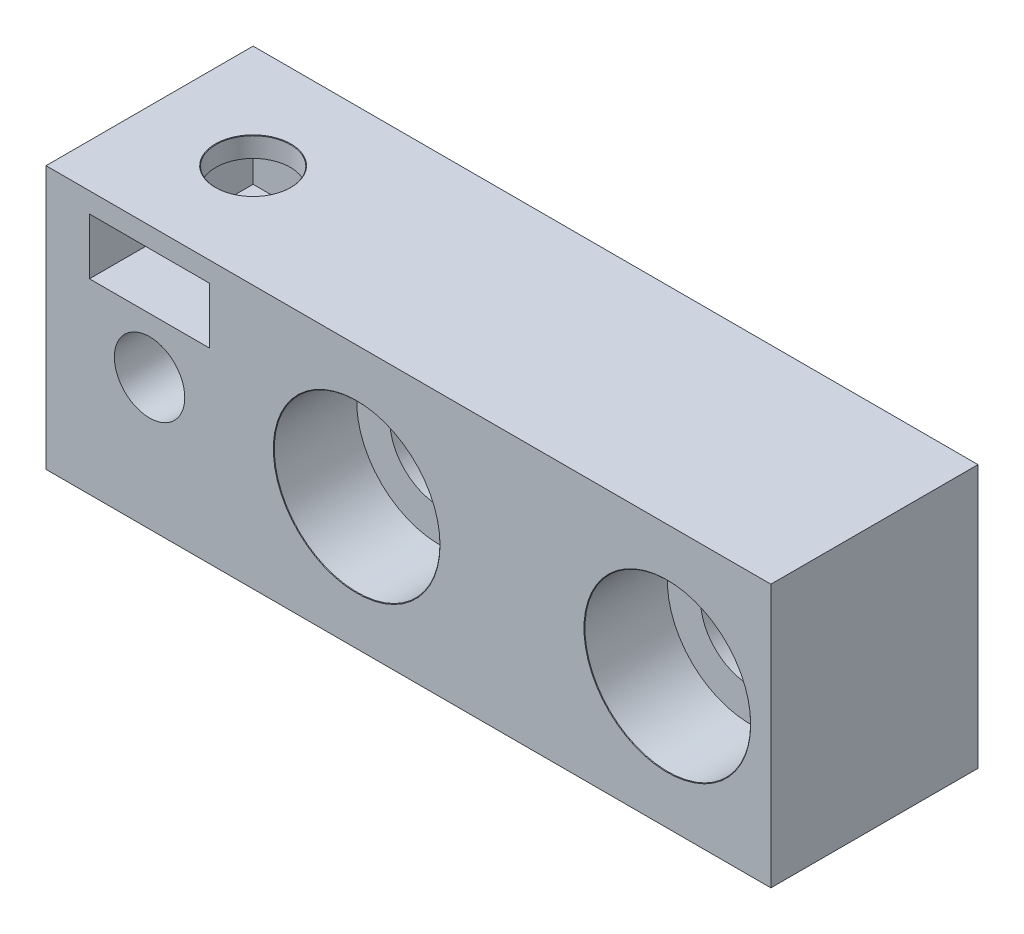
ISO-10303-21;
HEADER;
FILE_DESCRIPTION(('STEP AP214'),'2;1');
FILE_NAME('part.step','',(''),(''),'','','');
FILE_SCHEMA(('AUTOMOTIVE_DESIGN { 1 0 10303 214 1 1 1 1 }'));
ENDSEC;
DATA;
#1=APPLICATION_CONTEXT('core data for automotive mechanical design processes');
#2=APPLICATION_PROTOCOL_DEFINITION('international standard','automotive_design',2000,#1);
#3=PRODUCT_CONTEXT('',#1,'mechanical');
#4=PRODUCT('Part','Part','',(#3));
#5=PRODUCT_RELATED_PRODUCT_CATEGORY('part','',(#4));
#6=PRODUCT_DEFINITION_FORMATION('','',#4);
#7=PRODUCT_DEFINITION_CONTEXT('part definition',#1,'design');
#8=PRODUCT_DEFINITION('design','',#6,#7);
#9=PRODUCT_DEFINITION_SHAPE('','',#8);
#10=(LENGTH_UNIT() NAMED_UNIT(*) SI_UNIT(.MILLI.,.METRE.));
#11=(NAMED_UNIT(*) PLANE_ANGLE_UNIT() SI_UNIT($,.RADIAN.));
#12=(NAMED_UNIT(*) SI_UNIT($,.STERADIAN.) SOLID_ANGLE_UNIT());
#13=UNCERTAINTY_MEASURE_WITH_UNIT(LENGTH_MEASURE(1.E-05),#10,'distance_accuracy_value','');
#14=(GEOMETRIC_REPRESENTATION_CONTEXT(3) GLOBAL_UNCERTAINTY_ASSIGNED_CONTEXT((#13)) GLOBAL_UNIT_ASSIGNED_CONTEXT((#10,
#11,#12)) REPRESENTATION_CONTEXT('',''));
#15=CARTESIAN_POINT('',(0.,0.,0.));
#16=DIRECTION('',(0.,0.,1.));
#17=DIRECTION('',(1.,0.,0.));
#18=AXIS2_PLACEMENT_3D('',#15,#16,#17);
#19=CARTESIAN_POINT('',(-12.5,6.35,5.));
#20=DIRECTION('',(0.,1.,0.));
#21=DIRECTION('',(0.,0.,1.));
#22=AXIS2_PLACEMENT_3D('',#19,#20,#21);
#23=CYLINDRICAL_SURFACE('',#22,1.8);
#24=CARTESIAN_POINT('',(-12.5,5.38,5.));
#25=DIRECTION('',(0.,1.,0.));
#26=DIRECTION('',(0.,0.,1.));
#27=AXIS2_PLACEMENT_3D('',#24,#25,#26);
#28=CIRCLE('',#27,1.8);
#29=CARTESIAN_POINT('',(-12.5,5.38,6.8));
#30=VERTEX_POINT('',#29);
#31=EDGE_CURVE('E47',#30,#30,#28,.F.);
#32=ORIENTED_EDGE('',*,*,#31,.T.);
#33=EDGE_LOOP('',(#32));
#34=FACE_BOUND('',#33,.T.);
#35=CARTESIAN_POINT('',(-12.5,6.32902250922057,5.));
#36=DIRECTION('',(0.,1.,0.));
#37=DIRECTION('',(0.,0.,1.));
#38=AXIS2_PLACEMENT_3D('',#35,#36,#37);
#39=CIRCLE('',#38,1.8);
#40=CARTESIAN_POINT('',(-12.5,6.32902250922057,6.8));
#41=VERTEX_POINT('',#40);
#42=EDGE_CURVE('E179',#41,#41,#39,.T.);
#43=ORIENTED_EDGE('',*,*,#42,.T.);
#44=EDGE_LOOP('',(#43));
#45=FACE_BOUND('',#44,.T.);
#46=ADVANCED_FACE('F43',(#34,#45),#23,.F.);
#47=CARTESIAN_POINT('',(17.5,6.35,10.));
#48=DIRECTION('',(-1.,0.,0.));
#49=DIRECTION('',(0.,0.,1.));
#50=AXIS2_PLACEMENT_3D('',#47,#48,#49);
#51=PLANE('',#50);
#52=DIRECTION('',(0.,1.,0.));
#53=VECTOR('',#52,1.);
#54=CARTESIAN_POINT('',(17.5,6.35,0.));
#55=LINE('',#54,#53);
#56=CARTESIAN_POINT('',(17.5,-6.35,0.));
#57=VERTEX_POINT('',#56);
#58=CARTESIAN_POINT('',(17.5,6.35,0.));
#59=VERTEX_POINT('',#58);
#60=EDGE_CURVE('E235',#57,#59,#55,.T.);
#61=ORIENTED_EDGE('',*,*,#60,.T.);
#62=DIRECTION('',(0.,0.,-1.));
#63=VECTOR('',#62,1.);
#64=CARTESIAN_POINT('',(17.5,6.35,10.));
#65=LINE('',#64,#63);
#66=CARTESIAN_POINT('',(17.5,6.35,10.));
#67=VERTEX_POINT('',#66);
#68=EDGE_CURVE('E273',#67,#59,#65,.T.);
#69=ORIENTED_EDGE('',*,*,#68,.F.);
#70=DIRECTION('',(0.,1.,0.));
#71=VECTOR('',#70,1.);
#72=CARTESIAN_POINT('',(17.5,6.35,10.));
#73=LINE('',#72,#71);
#74=CARTESIAN_POINT('',(17.5,-6.35,10.));
#75=VERTEX_POINT('',#74);
#76=EDGE_CURVE('E236',#75,#67,#73,.T.);
#77=ORIENTED_EDGE('',*,*,#76,.F.);
#78=DIRECTION('',(0.,0.,-1.));
#79=VECTOR('',#78,1.);
#80=CARTESIAN_POINT('',(17.5,-6.35,10.));
#81=LINE('',#80,#79);
#82=EDGE_CURVE('E250',#75,#57,#81,.T.);
#83=ORIENTED_EDGE('',*,*,#82,.T.);
#84=EDGE_LOOP('',(#61,#69,#77,#83));
#85=FACE_BOUND('',#84,.T.);
#86=ADVANCED_FACE('F45',(#85),#51,.F.);
#87=CARTESIAN_POINT('',(-17.5,6.35,10.));
#88=DIRECTION('',(0.,-1.,0.));
#89=DIRECTION('',(0.,0.,-1.));
#90=AXIS2_PLACEMENT_3D('',#87,#88,#89);
#91=PLANE('',#90);
#92=CARTESIAN_POINT('',(-12.5,6.35,5.));
#93=DIRECTION('',(0.,1.,0.));
#94=DIRECTION('',(0.,0.,1.));
#95=AXIS2_PLACEMENT_3D('',#92,#93,#94);
#96=CIRCLE('',#95,1.825);
#97=CARTESIAN_POINT('',(-12.5,6.35,6.825));
#98=VERTEX_POINT('',#97);
#99=EDGE_CURVE('E175',#98,#98,#96,.T.);
#100=ORIENTED_EDGE('',*,*,#99,.F.);
#101=EDGE_LOOP('',(#100));
#102=FACE_BOUND('',#101,.T.);
#103=DIRECTION('',(-1.,0.,0.));
#104=VECTOR('',#103,1.);
#105=CARTESIAN_POINT('',(-17.5,6.35,0.));
#106=LINE('',#105,#104);
#107=CARTESIAN_POINT('',(-17.5,6.35,0.));
#108=VERTEX_POINT('',#107);
#109=EDGE_CURVE('E254',#59,#108,#106,.T.);
#110=ORIENTED_EDGE('',*,*,#109,.T.);
#111=DIRECTION('',(0.,0.,-1.));
#112=VECTOR('',#111,1.);
#113=CARTESIAN_POINT('',(-17.5,6.35,10.));
#114=LINE('',#113,#112);
#115=CARTESIAN_POINT('',(-17.5,6.35,10.));
#116=VERTEX_POINT('',#115);
#117=EDGE_CURVE('E269',#116,#108,#114,.T.);
#118=ORIENTED_EDGE('',*,*,#117,.F.);
#119=DIRECTION('',(-1.,0.,0.));
#120=VECTOR('',#119,1.);
#121=CARTESIAN_POINT('',(-17.5,6.35,10.));
#122=LINE('',#121,#120);
#123=EDGE_CURVE('E240',#67,#116,#122,.T.);
#124=ORIENTED_EDGE('',*,*,#123,.F.);
#125=ORIENTED_EDGE('',*,*,#68,.T.);
#126=EDGE_LOOP('',(#110,#118,#124,#125));
#127=FACE_BOUND('',#126,.T.);
#128=ADVANCED_FACE('F341',(#102,#127),#91,.F.);
#129=CARTESIAN_POINT('',(-17.5,6.35,10.));
#130=DIRECTION('',(1.,0.,0.));
#131=DIRECTION('',(0.,0.,-1.));
#132=AXIS2_PLACEMENT_3D('',#129,#130,#131);
#133=PLANE('',#132);
#134=DIRECTION('',(0.,-1.,0.));
#135=VECTOR('',#134,1.);
#136=CARTESIAN_POINT('',(-17.5,6.35,0.));
#137=LINE('',#136,#135);
#138=CARTESIAN_POINT('',(-17.5,-6.35,0.));
#139=VERTEX_POINT('',#138);
#140=EDGE_CURVE('E257',#108,#139,#137,.T.);
#141=ORIENTED_EDGE('',*,*,#140,.T.);
#142=DIRECTION('',(0.,0.,-1.));
#143=VECTOR('',#142,1.);
#144=CARTESIAN_POINT('',(-17.5,-6.35,10.));
#145=LINE('',#144,#143);
#146=CARTESIAN_POINT('',(-17.5,-6.35,10.));
#147=VERTEX_POINT('',#146);
#148=EDGE_CURVE('E265',#147,#139,#145,.T.);
#149=ORIENTED_EDGE('',*,*,#148,.F.);
#150=DIRECTION('',(0.,-1.,0.));
#151=VECTOR('',#150,1.);
#152=CARTESIAN_POINT('',(-17.5,6.35,10.));
#153=LINE('',#152,#151);
#154=EDGE_CURVE('E244',#116,#147,#153,.T.);
#155=ORIENTED_EDGE('',*,*,#154,.F.);
#156=ORIENTED_EDGE('',*,*,#117,.T.);
#157=EDGE_LOOP('',(#141,#149,#155,#156));
#158=FACE_BOUND('',#157,.T.);
#159=ADVANCED_FACE('F463',(#158),#133,.F.);
#160=CARTESIAN_POINT('',(-17.5,-6.35,10.));
#161=DIRECTION('',(0.,1.,0.));
#162=DIRECTION('',(0.,0.,1.));
#163=AXIS2_PLACEMENT_3D('',#160,#161,#162);
#164=PLANE('',#163);
#165=DIRECTION('',(1.,0.,0.));
#166=VECTOR('',#165,1.);
#167=CARTESIAN_POINT('',(-17.5,-6.35,0.));
#168=LINE('',#167,#166);
#169=EDGE_CURVE('E241',#139,#57,#168,.T.);
#170=ORIENTED_EDGE('',*,*,#169,.T.);
#171=ORIENTED_EDGE('',*,*,#82,.F.);
#172=DIRECTION('',(1.,0.,0.));
#173=VECTOR('',#172,1.);
#174=CARTESIAN_POINT('',(-17.5,-6.35,10.));
#175=LINE('',#174,#173);
#176=EDGE_CURVE('E247',#147,#75,#175,.T.);
#177=ORIENTED_EDGE('',*,*,#176,.F.);
#178=ORIENTED_EDGE('',*,*,#148,.T.);
#179=EDGE_LOOP('',(#170,#171,#177,#178));
#180=FACE_BOUND('',#179,.T.);
#181=ADVANCED_FACE('F382',(#180),#164,.F.);
#182=CARTESIAN_POINT('',(0.,0.,10.));
#183=DIRECTION('',(0.,0.,1.));
#184=DIRECTION('',(1.,0.,0.));
#185=AXIS2_PLACEMENT_3D('',#182,#183,#184);
#186=PLANE('',#185);
#187=DIRECTION('',(0.,-1.,0.));
#188=VECTOR('',#187,1.);
#189=CARTESIAN_POINT('',(-15.4,5.38,10.));
#190=LINE('',#189,#188);
#191=CARTESIAN_POINT('',(-15.4,5.38,10.));
#192=VERTEX_POINT('',#191);
#193=CARTESIAN_POINT('',(-15.4,2.67,10.));
#194=VERTEX_POINT('',#193);
#195=EDGE_CURVE('E61',#192,#194,#190,.T.);
#196=ORIENTED_EDGE('',*,*,#195,.F.);
#197=DIRECTION('',(-1.,0.,0.));
#198=VECTOR('',#197,1.);
#199=CARTESIAN_POINT('',(-15.4,5.38,10.));
#200=LINE('',#199,#198);
#201=CARTESIAN_POINT('',(-9.6,5.38,10.));
#202=VERTEX_POINT('',#201);
#203=EDGE_CURVE('E147',#202,#192,#200,.T.);
#204=ORIENTED_EDGE('',*,*,#203,.F.);
#205=DIRECTION('',(0.,1.,0.));
#206=VECTOR('',#205,1.);
#207=CARTESIAN_POINT('',(-9.6,5.38,10.));
#208=LINE('',#207,#206);
#209=CARTESIAN_POINT('',(-9.6,2.67,10.));
#210=VERTEX_POINT('',#209);
#211=EDGE_CURVE('E151',#210,#202,#208,.T.);
#212=ORIENTED_EDGE('',*,*,#211,.F.);
#213=DIRECTION('',(1.,0.,0.));
#214=VECTOR('',#213,1.);
#215=CARTESIAN_POINT('',(-15.4,2.67,10.));
#216=LINE('',#215,#214);
#217=EDGE_CURVE('E160',#194,#210,#216,.T.);
#218=ORIENTED_EDGE('',*,*,#217,.F.);
#219=EDGE_LOOP('',(#196,#204,#212,#218));
#220=FACE_BOUND('',#219,.T.);
#221=CARTESIAN_POINT('',(-12.5,0.,10.));
#222=DIRECTION('',(0.,0.,1.));
#223=DIRECTION('',(1.,0.,0.));
#224=AXIS2_PLACEMENT_3D('',#221,#222,#223);
#225=CIRCLE('',#224,1.7);
#226=CARTESIAN_POINT('',(-10.8,0.,10.));
#227=VERTEX_POINT('',#226);
#228=EDGE_CURVE('E187',#227,#227,#225,.T.);
#229=ORIENTED_EDGE('',*,*,#228,.F.);
#230=EDGE_LOOP('',(#229));
#231=FACE_BOUND('',#230,.T.);
#232=CARTESIAN_POINT('',(12.5,0.,10.));
#233=DIRECTION('',(0.,0.,1.));
#234=DIRECTION('',(1.,0.,0.));
#235=AXIS2_PLACEMENT_3D('',#232,#233,#234);
#236=CIRCLE('',#235,4.025);
#237=CARTESIAN_POINT('',(16.525,0.,10.));
#238=VERTEX_POINT('',#237);
#239=EDGE_CURVE('E192',#238,#238,#236,.T.);
#240=ORIENTED_EDGE('',*,*,#239,.F.);
#241=EDGE_LOOP('',(#240));
#242=FACE_BOUND('',#241,.T.);
#243=CARTESIAN_POINT('',(-2.5,0.,10.));
#244=DIRECTION('',(0.,0.,1.));
#245=DIRECTION('',(1.,0.,0.));
#246=AXIS2_PLACEMENT_3D('',#243,#244,#245);
#247=CIRCLE('',#246,4.025);
#248=CARTESIAN_POINT('',(1.525,0.,10.));
#249=VERTEX_POINT('',#248);
#250=EDGE_CURVE('E215',#249,#249,#247,.T.);
#251=ORIENTED_EDGE('',*,*,#250,.F.);
#252=EDGE_LOOP('',(#251));
#253=FACE_BOUND('',#252,.T.);
#254=ORIENTED_EDGE('',*,*,#76,.T.);
#255=ORIENTED_EDGE('',*,*,#123,.T.);
#256=ORIENTED_EDGE('',*,*,#154,.T.);
#257=ORIENTED_EDGE('',*,*,#176,.T.);
#258=EDGE_LOOP('',(#254,#255,#256,#257));
#259=FACE_BOUND('',#258,.T.);
#260=ADVANCED_FACE('F377',(#220,#231,#242,#253,#259),#186,.T.);
#261=CARTESIAN_POINT('',(0.,0.,0.));
#262=DIRECTION('',(0.,0.,1.));
#263=DIRECTION('',(1.,0.,0.));
#264=AXIS2_PLACEMENT_3D('',#261,#262,#263);
#265=PLANE('',#264);
#266=CARTESIAN_POINT('',(-12.5,0.,0.));
#267=DIRECTION('',(0.,0.,1.));
#268=DIRECTION('',(1.,0.,0.));
#269=AXIS2_PLACEMENT_3D('',#266,#267,#268);
#270=CIRCLE('',#269,1.7);
#271=CARTESIAN_POINT('',(-10.8,0.,0.));
#272=VERTEX_POINT('',#271);
#273=EDGE_CURVE('E188',#272,#272,#270,.T.);
#274=ORIENTED_EDGE('',*,*,#273,.T.);
#275=EDGE_LOOP('',(#274));
#276=FACE_BOUND('',#275,.T.);
#277=CARTESIAN_POINT('',(12.5,0.,0.));
#278=DIRECTION('',(0.,0.,1.));
#279=DIRECTION('',(1.,0.,0.));
#280=AXIS2_PLACEMENT_3D('',#277,#278,#279);
#281=CIRCLE('',#280,2.40000000000001);
#282=CARTESIAN_POINT('',(14.9,0.,0.));
#283=VERTEX_POINT('',#282);
#284=EDGE_CURVE('E211',#283,#283,#281,.T.);
#285=ORIENTED_EDGE('',*,*,#284,.T.);
#286=EDGE_LOOP('',(#285));
#287=FACE_BOUND('',#286,.T.);
#288=CARTESIAN_POINT('',(-2.5,0.,0.));
#289=DIRECTION('',(0.,0.,1.));
#290=DIRECTION('',(1.,0.,0.));
#291=AXIS2_PLACEMENT_3D('',#288,#289,#290);
#292=CIRCLE('',#291,2.40000000000001);
#293=CARTESIAN_POINT('',(-0.0999999999999898,0.,0.));
#294=VERTEX_POINT('',#293);
#295=EDGE_CURVE('E231',#294,#294,#292,.T.);
#296=ORIENTED_EDGE('',*,*,#295,.T.);
#297=EDGE_LOOP('',(#296));
#298=FACE_BOUND('',#297,.T.);
#299=ORIENTED_EDGE('',*,*,#60,.F.);
#300=ORIENTED_EDGE('',*,*,#169,.F.);
#301=ORIENTED_EDGE('',*,*,#140,.F.);
#302=ORIENTED_EDGE('',*,*,#109,.F.);
#303=EDGE_LOOP('',(#299,#300,#301,#302));
#304=FACE_BOUND('',#303,.T.);
#305=ADVANCED_FACE('F381',(#276,#287,#298,#304),#265,.F.);
#306=CARTESIAN_POINT('',(-2.5,0.,10.));
#307=DIRECTION('',(0.,0.,1.));
#308=DIRECTION('',(1.,0.,0.));
#309=AXIS2_PLACEMENT_3D('',#306,#307,#308);
#310=CYLINDRICAL_SURFACE('',#309,2.40000000000001);
#311=ORIENTED_EDGE('',*,*,#295,.F.);
#312=EDGE_LOOP('',(#311));
#313=FACE_BOUND('',#312,.T.);
#314=CARTESIAN_POINT('',(-2.5,0.,6.));
#315=DIRECTION('',(0.,0.,1.));
#316=DIRECTION('',(1.,0.,0.));
#317=AXIS2_PLACEMENT_3D('',#314,#315,#316);
#318=CIRCLE('',#317,2.40000000000001);
#319=CARTESIAN_POINT('',(-0.0999999999999881,0.,6.));
#320=VERTEX_POINT('',#319);
#321=EDGE_CURVE('E227',#320,#320,#318,.T.);
#322=ORIENTED_EDGE('',*,*,#321,.T.);
#323=EDGE_LOOP('',(#322));
#324=FACE_BOUND('',#323,.T.);
#325=ADVANCED_FACE('F467',(#313,#324),#310,.F.);
#326=CARTESIAN_POINT('',(1.5,0.,6.));
#327=DIRECTION('',(0.,0.,-1.));
#328=DIRECTION('',(-1.,0.,0.));
#329=AXIS2_PLACEMENT_3D('',#326,#327,#328);
#330=PLANE('',#329);
#331=ORIENTED_EDGE('',*,*,#321,.F.);
#332=EDGE_LOOP('',(#331));
#333=FACE_BOUND('',#332,.T.);
#334=CARTESIAN_POINT('',(-2.5,0.,6.));
#335=DIRECTION('',(0.,0.,1.));
#336=DIRECTION('',(1.,0.,0.));
#337=AXIS2_PLACEMENT_3D('',#334,#335,#336);
#338=CIRCLE('',#337,4.);
#339=CARTESIAN_POINT('',(1.5,0.,6.));
#340=VERTEX_POINT('',#339);
#341=EDGE_CURVE('E223',#340,#340,#338,.T.);
#342=ORIENTED_EDGE('',*,*,#341,.T.);
#343=EDGE_LOOP('',(#342));
#344=FACE_BOUND('',#343,.T.);
#345=ADVANCED_FACE('F473',(#333,#344),#330,.F.);
#346=CARTESIAN_POINT('',(-2.5,0.,10.));
#347=DIRECTION('',(0.,0.,1.));
#348=DIRECTION('',(1.,0.,0.));
#349=AXIS2_PLACEMENT_3D('',#346,#347,#348);
#350=CYLINDRICAL_SURFACE('',#349,4.);
#351=ORIENTED_EDGE('',*,*,#341,.F.);
#352=EDGE_LOOP('',(#351));
#353=FACE_BOUND('',#352,.T.);
#354=CARTESIAN_POINT('',(-2.5,0.,9.97902250922057));
#355=DIRECTION('',(0.,0.,1.));
#356=DIRECTION('',(1.,0.,0.));
#357=AXIS2_PLACEMENT_3D('',#354,#355,#356);
#358=CIRCLE('',#357,4.);
#359=CARTESIAN_POINT('',(1.5,0.,9.97902250922057));
#360=VERTEX_POINT('',#359);
#361=EDGE_CURVE('E219',#360,#360,#358,.T.);
#362=ORIENTED_EDGE('',*,*,#361,.T.);
#363=EDGE_LOOP('',(#362));
#364=FACE_BOUND('',#363,.T.);
#365=ADVANCED_FACE('F513',(#353,#364),#350,.F.);
#366=CARTESIAN_POINT('',(-2.5,0.,10.));
#367=DIRECTION('',(0.,0.,1.));
#368=DIRECTION('',(1.,0.,0.));
#369=AXIS2_PLACEMENT_3D('',#366,#367,#368);
#370=CONICAL_SURFACE('',#369,4.025,0.872664625997176);
#371=ORIENTED_EDGE('',*,*,#361,.F.);
#372=EDGE_LOOP('',(#371));
#373=FACE_BOUND('',#372,.T.);
#374=ORIENTED_EDGE('',*,*,#250,.T.);
#375=EDGE_LOOP('',(#374));
#376=FACE_BOUND('',#375,.T.);
#377=ADVANCED_FACE('F524',(#373,#376),#370,.F.);
#378=CARTESIAN_POINT('',(12.5,0.,10.));
#379=DIRECTION('',(0.,0.,1.));
#380=DIRECTION('',(1.,0.,0.));
#381=AXIS2_PLACEMENT_3D('',#378,#379,#380);
#382=CYLINDRICAL_SURFACE('',#381,2.40000000000001);
#383=ORIENTED_EDGE('',*,*,#284,.F.);
#384=EDGE_LOOP('',(#383));
#385=FACE_BOUND('',#384,.T.);
#386=CARTESIAN_POINT('',(12.5,0.,6.));
#387=DIRECTION('',(0.,0.,1.));
#388=DIRECTION('',(1.,0.,0.));
#389=AXIS2_PLACEMENT_3D('',#386,#387,#388);
#390=CIRCLE('',#389,2.40000000000001);
#391=CARTESIAN_POINT('',(14.9,0.,6.));
#392=VERTEX_POINT('',#391);
#393=EDGE_CURVE('E207',#392,#392,#390,.T.);
#394=ORIENTED_EDGE('',*,*,#393,.T.);
#395=EDGE_LOOP('',(#394));
#396=FACE_BOUND('',#395,.T.);
#397=ADVANCED_FACE('F535',(#385,#396),#382,.F.);
#398=CARTESIAN_POINT('',(16.5,0.,6.));
#399=DIRECTION('',(0.,0.,-1.));
#400=DIRECTION('',(-1.,0.,0.));
#401=AXIS2_PLACEMENT_3D('',#398,#399,#400);
#402=PLANE('',#401);
#403=ORIENTED_EDGE('',*,*,#393,.F.);
#404=EDGE_LOOP('',(#403));
#405=FACE_BOUND('',#404,.T.);
#406=CARTESIAN_POINT('',(12.5,0.,6.));
#407=DIRECTION('',(0.,0.,1.));
#408=DIRECTION('',(1.,0.,0.));
#409=AXIS2_PLACEMENT_3D('',#406,#407,#408);
#410=CIRCLE('',#409,4.);
#411=CARTESIAN_POINT('',(16.5,0.,6.));
#412=VERTEX_POINT('',#411);
#413=EDGE_CURVE('E203',#412,#412,#410,.T.);
#414=ORIENTED_EDGE('',*,*,#413,.T.);
#415=EDGE_LOOP('',(#414));
#416=FACE_BOUND('',#415,.T.);
#417=ADVANCED_FACE('F546',(#405,#416),#402,.F.);
#418=CARTESIAN_POINT('',(12.5,0.,10.));
#419=DIRECTION('',(0.,0.,1.));
#420=DIRECTION('',(1.,0.,0.));
#421=AXIS2_PLACEMENT_3D('',#418,#419,#420);
#422=CYLINDRICAL_SURFACE('',#421,4.);
#423=ORIENTED_EDGE('',*,*,#413,.F.);
#424=EDGE_LOOP('',(#423));
#425=FACE_BOUND('',#424,.T.);
#426=CARTESIAN_POINT('',(12.5,0.,9.97902250922057));
#427=DIRECTION('',(0.,0.,1.));
#428=DIRECTION('',(1.,0.,0.));
#429=AXIS2_PLACEMENT_3D('',#426,#427,#428);
#430=CIRCLE('',#429,4.);
#431=CARTESIAN_POINT('',(16.5,0.,9.97902250922057));
#432=VERTEX_POINT('',#431);
#433=EDGE_CURVE('E199',#432,#432,#430,.T.);
#434=ORIENTED_EDGE('',*,*,#433,.T.);
#435=EDGE_LOOP('',(#434));
#436=FACE_BOUND('',#435,.T.);
#437=ADVANCED_FACE('F557',(#425,#436),#422,.F.);
#438=CARTESIAN_POINT('',(12.5,0.,10.));
#439=DIRECTION('',(0.,0.,1.));
#440=DIRECTION('',(1.,0.,0.));
#441=AXIS2_PLACEMENT_3D('',#438,#439,#440);
#442=CONICAL_SURFACE('',#441,4.025,0.872664625997159);
#443=ORIENTED_EDGE('',*,*,#433,.F.);
#444=EDGE_LOOP('',(#443));
#445=FACE_BOUND('',#444,.T.);
#446=ORIENTED_EDGE('',*,*,#239,.T.);
#447=EDGE_LOOP('',(#446));
#448=FACE_BOUND('',#447,.T.);
#449=ADVANCED_FACE('F347',(#445,#448),#442,.F.);
#450=CARTESIAN_POINT('',(-12.5,0.,0.));
#451=DIRECTION('',(0.,0.,1.));
#452=DIRECTION('',(1.,0.,0.));
#453=AXIS2_PLACEMENT_3D('',#450,#451,#452);
#454=CYLINDRICAL_SURFACE('',#453,1.7);
#455=CARTESIAN_POINT('',(-14.1443130364959,0.431549114249591,5.73228043672461));
#456=CARTESIAN_POINT('',(-14.1363540820694,0.461841781342303,5.75016915651166));
#457=CARTESIAN_POINT('',(-14.1276927849097,0.491468233752192,5.76881582944267));
#458=CARTESIAN_POINT('',(-14.1090134945183,0.549556478589206,5.80717036018508));
#459=CARTESIAN_POINT('',(-14.0989964759909,0.578019088798076,5.82687744952701));
#460=CARTESIAN_POINT('',(-14.0669793338843,0.66193847542872,5.88692200291945));
#461=CARTESIAN_POINT('',(-14.0430024132878,0.715966641980759,5.92820774772644));
#462=CARTESIAN_POINT('',(-13.9893919017726,0.821754227012617,6.01204627924096));
#463=CARTESIAN_POINT('',(-13.9596714081066,0.873461422505188,6.05460873020936));
#464=CARTESIAN_POINT('',(-13.8947095105217,0.973836488246323,6.13913454818795));
#465=CARTESIAN_POINT('',(-13.85946764662,1.02250410479607,6.18109786496645));
#466=CARTESIAN_POINT('',(-13.7869255743393,1.11212389095652,6.25952320718347));
#467=CARTESIAN_POINT('',(-13.7501427199371,1.1533691384086,6.2961280707358));
#468=CARTESIAN_POINT('',(-13.6717746377266,1.23290752583321,6.36738771046429));
#469=CARTESIAN_POINT('',(-13.6301892391105,1.27120056072619,6.40204241721573));
#470=CARTESIAN_POINT('',(-13.5424118464174,1.34410146671346,6.46846357910051));
#471=CARTESIAN_POINT('',(-13.4962528922248,1.37873249896947,6.50024797468455));
#472=CARTESIAN_POINT('',(-13.3991369736146,1.44394305063383,6.56038876580602));
#473=CARTESIAN_POINT('',(-13.3481837682141,1.47452569970115,6.58874780785803));
#474=CARTESIAN_POINT('',(-13.2311368643515,1.53643488285444,6.6463533416837));
#475=CARTESIAN_POINT('',(-13.1640321554195,1.56673443402629,6.67468622361968));
#476=CARTESIAN_POINT('',(-13.0239554295339,1.61896572489017,6.72364947365179));
#477=CARTESIAN_POINT('',(-12.9509849462037,1.64089964324082,6.74428184715839));
#478=CARTESIAN_POINT('',(-12.8002583450267,1.67506683437185,6.77646149415908));
#479=CARTESIAN_POINT('',(-12.7224725201684,1.68723170377963,6.78794470040386));
#480=CARTESIAN_POINT('',(-12.5651419101505,1.70058144813417,6.80054773407517));
#481=CARTESIAN_POINT('',(-12.4855981388998,1.70177249477587,6.80167338660548));
#482=CARTESIAN_POINT('',(-12.3360754524795,1.69355767079285,6.79391652115586));
#483=CARTESIAN_POINT('',(-12.2659752185196,1.68525998993292,6.7860806150771));
#484=CARTESIAN_POINT('',(-12.1286127049306,1.66040529798181,6.76264820220165));
#485=CARTESIAN_POINT('',(-12.0613509829894,1.64384667196489,6.74705017799604));
#486=CARTESIAN_POINT('',(-11.9294053301473,1.60291026025842,6.70858732170969));
#487=CARTESIAN_POINT('',(-11.8648348477832,1.57833927626562,6.68554308208648));
#488=CARTESIAN_POINT('',(-11.7411362903407,1.52273852583637,6.63359589400789));
#489=CARTESIAN_POINT('',(-11.6820089313673,1.49170791130833,6.60469217626859));
#490=CARTESIAN_POINT('',(-11.540633433711,1.40693543409383,6.52613607278867));
#491=CARTESIAN_POINT('',(-11.4621209760681,1.34971780038533,6.47345477321867));
#492=CARTESIAN_POINT('',(-11.3544466300557,1.25697017198347,6.38917561710838));
#493=CARTESIAN_POINT('',(-11.3201573149752,1.22480268850741,6.36011915440404));
#494=CARTESIAN_POINT('',(-11.2548966848814,1.15839619098938,6.30063955305479));
#495=CARTESIAN_POINT('',(-11.2239257044412,1.12415696860658,6.27021627703815));
#496=CARTESIAN_POINT('',(-11.1544719278957,1.040903367535,6.19705885277287));
#497=CARTESIAN_POINT('',(-11.117404301319,0.991078531085982,6.15390466072971));
#498=CARTESIAN_POINT('',(-11.0491490531793,0.888171348250882,6.06681146348));
#499=CARTESIAN_POINT('',(-11.0179627524597,0.835088273660714,6.02287228439883));
#500=CARTESIAN_POINT('',(-10.975657331689,0.753198514171107,5.95762418917986));
#501=CARTESIAN_POINT('',(-10.9623589516398,0.725673304679791,5.93609520453766));
#502=CARTESIAN_POINT('',(-10.9371722757452,0.669709579800917,5.89341112164763));
#503=CARTESIAN_POINT('',(-10.9252836728742,0.64127126499289,5.87225594284844));
#504=CARTESIAN_POINT('',(-10.902922204938,0.58336012748031,5.83060108151332));
#505=CARTESIAN_POINT('',(-10.8924495697896,0.553887137747477,5.81010150584206));
#506=CARTESIAN_POINT('',(-10.8729608737253,0.493695979504361,5.77022454130086));
#507=CARTESIAN_POINT('',(-10.8639459101629,0.462976894478189,5.75084800484398));
#508=CARTESIAN_POINT('',(-10.8556869635041,0.431549114249592,5.73228043672461));
#509=B_SPLINE_CURVE_WITH_KNOTS('',3,(#455,#456,#457,#458,#459,#460,#461,#462,#463,#464,#465,
#466,#467,#468,#469,#470,#471,#472,#473,#474,#475,#476,#477,#478,#479,#480,#481,#482,#483,#484,
#485,#486,#487,#488,#489,#490,#491,#492,#493,#494,#495,#496,#497,#498,#499,#500,#501,#502,#503,
#504,#505,#506,#507,#508),.UNSPECIFIED.,.F.,.F.,(4,2,2,2,2,2,2,2,2,2,2,2,2,2,2,2,2,2,2,2,2,2,2,
2,2,2,4),(0.,0.108143707631303,0.216210073659566,0.432198801732679,0.651755579439904,
0.871330658056765,1.06995212271564,1.26858065374493,1.46586649639961,1.66299892254348,
1.89873284382957,2.13440533103087,2.37171396182587,2.60888912172698,2.82096271111959,
3.03307777486796,3.25074118626533,3.46843319296184,3.79801050986653,3.9637130207352,
4.12943222297401,4.35597641998723,4.58257143445777,4.69470862205992,4.80682134306366,
4.91895224648482,5.03116717435876),.UNSPECIFIED.);
#510=CARTESIAN_POINT('',(-14.1443130364959,0.431549114249591,5.7322804367246));
#511=VERTEX_POINT('',#510);
#512=CARTESIAN_POINT('',(-10.8556869635041,0.431549114249591,5.7322804367246));
#513=VERTEX_POINT('',#512);
#514=EDGE_CURVE('E53',#511,#513,#509,.T.);
#515=ORIENTED_EDGE('',*,*,#514,.T.);
#516=CARTESIAN_POINT('',(-10.8880125177098,0.53990402567456,6.15031064373181));
#517=CARTESIAN_POINT('',(-10.8793122973536,0.51395631858702,6.06370403917706));
#518=CARTESIAN_POINT('',(-10.8718925164968,0.489686278623683,5.97640021925428));
#519=CARTESIAN_POINT('',(-10.8593228883446,0.445753318578163,5.80022462510665));
#520=CARTESIAN_POINT('',(-10.8541795636115,0.426103711523002,5.7113490945856));
#521=CARTESIAN_POINT('',(-10.8460268440259,0.393263243775808,5.53470148478117));
#522=CARTESIAN_POINT('',(-10.8429649448032,0.379916285346134,5.4469617433873));
#523=CARTESIAN_POINT('',(-10.8385523833375,0.360132873917026,5.27076872575272));
#524=CARTESIAN_POINT('',(-10.8371993594456,0.353686885727308,5.18231660463507));
#525=CARTESIAN_POINT('',(-10.8359796178012,0.347928736220361,4.98999918702134));
#526=CARTESIAN_POINT('',(-10.8364067265613,0.350025446603232,4.88608546093046));
#527=CARTESIAN_POINT('',(-10.8394861297949,0.364335577097406,4.67883061351018));
#528=CARTESIAN_POINT('',(-10.8421425313802,0.376567669485169,4.57549090369369));
#529=CARTESIAN_POINT('',(-10.8500962586829,0.410017068348243,4.36710809641937));
#530=CARTESIAN_POINT('',(-10.8554739038809,0.431504495256571,4.26211342766283));
#531=CARTESIAN_POINT('',(-10.8693237448987,0.481210972905737,4.05431209649284));
#532=CARTESIAN_POINT('',(-10.877784888025,0.509405857197143,3.95149899018964));
#533=CARTESIAN_POINT('',(-10.8880125177098,0.539904025674669,3.84968935626783));
#534=B_SPLINE_CURVE_WITH_KNOTS('',3,(#516,#517,#518,#519,#520,#521,#522,#523,#524,#525,#526,
#527,#528,#529,#530,#531,#532,#533),.UNSPECIFIED.,.F.,.F.,(4,2,2,2,2,2,2,2,4),(0.,
0.272552937583347,0.545881824082217,0.812031019675876,1.07781199580276,1.38905575360606,
1.70087418978114,2.02248543496332,2.34295503546221),.UNSPECIFIED.);
#535=CARTESIAN_POINT('',(-10.8556869635041,0.431549114249591,4.2677195632754));
#536=VERTEX_POINT('',#535);
#537=EDGE_CURVE('E11',#513,#536,#534,.T.);
#538=ORIENTED_EDGE('',*,*,#537,.T.);
#539=CARTESIAN_POINT('',(-10.8556869635041,0.431549114249591,4.26771956327539));
#540=CARTESIAN_POINT('',(-10.8636459179306,0.461841781342303,4.24983084348834));
#541=CARTESIAN_POINT('',(-10.8723072150903,0.491468233752192,4.23118417055733));
#542=CARTESIAN_POINT('',(-10.8909865054817,0.549556478589206,4.19282963981492));
#543=CARTESIAN_POINT('',(-10.9010035240091,0.578019088798076,4.17312255047299));
#544=CARTESIAN_POINT('',(-10.9330206661157,0.66193847542872,4.11307799708055));
#545=CARTESIAN_POINT('',(-10.9569975867122,0.715966641980759,4.07179225227356));
#546=CARTESIAN_POINT('',(-11.0106080982274,0.821754227012617,3.98795372075904));
#547=CARTESIAN_POINT('',(-11.0403285918934,0.873461422505189,3.94539126979065));
#548=CARTESIAN_POINT('',(-11.1052904894783,0.973836488246323,3.86086545181205));
#549=CARTESIAN_POINT('',(-11.14053235338,1.02250410479607,3.81890213503355));
#550=CARTESIAN_POINT('',(-11.2130744256607,1.11212389095652,3.74047679281653));
#551=CARTESIAN_POINT('',(-11.2498572800629,1.1533691384086,3.7038719292642));
#552=CARTESIAN_POINT('',(-11.3282253622734,1.23290752583321,3.63261228953571));
#553=CARTESIAN_POINT('',(-11.3698107608895,1.27120056072619,3.59795758278427));
#554=CARTESIAN_POINT('',(-11.4575881535826,1.34410146671346,3.53153642089949));
#555=CARTESIAN_POINT('',(-11.5037471077752,1.37873249896947,3.49975202531545));
#556=CARTESIAN_POINT('',(-11.6008630263854,1.44394305063383,3.43961123419398));
#557=CARTESIAN_POINT('',(-11.6518162317859,1.47452569970114,3.41125219214197));
#558=CARTESIAN_POINT('',(-11.7688631356485,1.53643488285444,3.3536466583163));
#559=CARTESIAN_POINT('',(-11.8359678445805,1.56673443402629,3.32531377638032));
#560=CARTESIAN_POINT('',(-11.9760445704661,1.61896572489017,3.27635052634821));
#561=CARTESIAN_POINT('',(-12.0490150537963,1.64089964324082,3.25571815284161));
#562=CARTESIAN_POINT('',(-12.1997416549733,1.67506683437185,3.22353850584092));
#563=CARTESIAN_POINT('',(-12.2775274798316,1.68723170377963,3.21205529959614));
#564=CARTESIAN_POINT('',(-12.4348580898495,1.70058144813417,3.19945226592483));
#565=CARTESIAN_POINT('',(-12.5144018611002,1.70177249477587,3.19832661339452));
#566=CARTESIAN_POINT('',(-12.6639245475205,1.69355767079285,3.20608347884414));
#567=CARTESIAN_POINT('',(-12.7340247814804,1.68525998993292,3.2139193849229));
#568=CARTESIAN_POINT('',(-12.8713872950694,1.66040529798181,3.23735179779835));
#569=CARTESIAN_POINT('',(-12.9386490170106,1.64384667196489,3.25294982200396));
#570=CARTESIAN_POINT('',(-13.0705946698527,1.60291026025842,3.29141267829031));
#571=CARTESIAN_POINT('',(-13.1351651522168,1.57833927626562,3.31445691791352));
#572=CARTESIAN_POINT('',(-13.2588637096593,1.52273852583638,3.36640410599211));
#573=CARTESIAN_POINT('',(-13.3179910686327,1.49170791130833,3.39530782373141));
#574=CARTESIAN_POINT('',(-13.459366566289,1.40693543409383,3.47386392721133));
#575=CARTESIAN_POINT('',(-13.5378790239319,1.34971780038533,3.52654522678133));
#576=CARTESIAN_POINT('',(-13.6455533699443,1.25697017198347,3.61082438289162));
#577=CARTESIAN_POINT('',(-13.6798426850248,1.22480268850741,3.63988084559596));
#578=CARTESIAN_POINT('',(-13.7451033151187,1.15839619098938,3.69936044694521));
#579=CARTESIAN_POINT('',(-13.7760742955588,1.12415696860658,3.72978372296185));
#580=CARTESIAN_POINT('',(-13.8455280721043,1.040903367535,3.80294114722713));
#581=CARTESIAN_POINT('',(-13.882595698681,0.991078531085982,3.84609533927029));
#582=CARTESIAN_POINT('',(-13.9508509468207,0.888171348250882,3.93318853652));
#583=CARTESIAN_POINT('',(-13.9820372475403,0.835088273660714,3.97712771560117));
#584=CARTESIAN_POINT('',(-14.024342668311,0.753198514171106,4.04237581082014));
#585=CARTESIAN_POINT('',(-14.0376410483602,0.72567330467979,4.06390479546234));
#586=CARTESIAN_POINT('',(-14.0628277242548,0.669709579800916,4.10658887835237));
#587=CARTESIAN_POINT('',(-14.0747163271258,0.64127126499289,4.12774405715156));
#588=CARTESIAN_POINT('',(-14.097077795062,0.58336012748031,4.16939891848668));
#589=CARTESIAN_POINT('',(-14.1075504302104,0.553887137747476,4.18989849415794));
#590=CARTESIAN_POINT('',(-14.1270391262747,0.49369597950436,4.22977545869914));
#591=CARTESIAN_POINT('',(-14.1360540898371,0.462976894478188,4.24915199515602));
#592=CARTESIAN_POINT('',(-14.1443130364959,0.431549114249592,4.26771956327539));
#593=B_SPLINE_CURVE_WITH_KNOTS('',3,(#539,#540,#541,#542,#543,#544,#545,#546,#547,#548,#549,
#550,#551,#552,#553,#554,#555,#556,#557,#558,#559,#560,#561,#562,#563,#564,#565,#566,#567,#568,
#569,#570,#571,#572,#573,#574,#575,#576,#577,#578,#579,#580,#581,#582,#583,#584,#585,#586,#587,
#588,#589,#590,#591,#592),.UNSPECIFIED.,.F.,.F.,(4,2,2,2,2,2,2,2,2,2,2,2,2,2,2,2,2,2,2,2,2,2,2,
2,2,2,4),(0.,0.108143707631303,0.216210073659566,0.432198801732679,0.651755579439904,
0.871330658056766,1.06995212271564,1.26858065374493,1.46586649639961,1.66299892254348,
1.89873284382958,2.13440533103087,2.37171396182587,2.60888912172698,2.82096271111959,
3.03307777486796,3.25074118626532,3.46843319296184,3.79801050986653,3.9637130207352,
4.12943222297401,4.35597641998723,4.58257143445777,4.69470862205992,4.80682134306366,
4.91895224648482,5.03116717435876),.UNSPECIFIED.);
#594=CARTESIAN_POINT('',(-14.1443130364959,0.431549114249591,4.2677195632754));
#595=VERTEX_POINT('',#594);
#596=EDGE_CURVE('E287',#536,#595,#593,.T.);
#597=ORIENTED_EDGE('',*,*,#596,.T.);
#598=CARTESIAN_POINT('',(-14.1119874822902,0.539904025674669,3.84968935626783));
#599=CARTESIAN_POINT('',(-14.1206877026464,0.513956318587122,3.93629596082258));
#600=CARTESIAN_POINT('',(-14.1281074835031,0.489686278623777,4.02359978074537));
#601=CARTESIAN_POINT('',(-14.1406771116554,0.445753318578241,4.19977537489301));
#602=CARTESIAN_POINT('',(-14.1458204363885,0.426103711523072,4.28865090541406));
#603=CARTESIAN_POINT('',(-14.1539731559741,0.393263243775861,4.4652985152185));
#604=CARTESIAN_POINT('',(-14.1570350551968,0.379916285346178,4.55303825661238));
#605=CARTESIAN_POINT('',(-14.1614476166625,0.360132873917052,4.72923127424698));
#606=CARTESIAN_POINT('',(-14.1628006405544,0.353686885727325,4.81768339536464));
#607=CARTESIAN_POINT('',(-14.1640203821988,0.34792873622036,5.01000081297836));
#608=CARTESIAN_POINT('',(-14.1635932734387,0.350025446603221,5.11391453906924));
#609=CARTESIAN_POINT('',(-14.1605138702051,0.364335577097374,5.32116938648951));
#610=CARTESIAN_POINT('',(-14.1578574686198,0.376567669485127,5.42450909630599));
#611=CARTESIAN_POINT('',(-14.1499037413171,0.41001706834818,5.6328919035803));
#612=CARTESIAN_POINT('',(-14.1445260961191,0.431504495256498,5.73788657233683));
#613=CARTESIAN_POINT('',(-14.1306762551013,0.481210972905645,5.94568790350681));
#614=CARTESIAN_POINT('',(-14.1222151119751,0.509405857197042,6.04850100981));
#615=CARTESIAN_POINT('',(-14.1119874822902,0.53990402567456,6.15031064373181));
#616=B_SPLINE_CURVE_WITH_KNOTS('',3,(#598,#599,#600,#601,#602,#603,#604,#605,#606,#607,#608,
#609,#610,#611,#612,#613,#614,#615),.UNSPECIFIED.,.F.,.F.,(4,2,2,2,2,2,2,2,4),(0.,
0.272552937583371,0.545881824082266,0.812031019675948,1.07781199580286,1.38905575360614,
1.70087418978119,2.02248543496335,2.34295503546221),.UNSPECIFIED.);
#617=EDGE_CURVE('E277',#595,#511,#616,.T.);
#618=ORIENTED_EDGE('',*,*,#617,.T.);
#619=EDGE_LOOP('',(#515,#538,#597,#618));
#620=FACE_BOUND('',#619,.T.);
#621=ORIENTED_EDGE('',*,*,#273,.F.);
#622=EDGE_LOOP('',(#621));
#623=FACE_BOUND('',#622,.T.);
#624=ORIENTED_EDGE('',*,*,#228,.T.);
#625=EDGE_LOOP('',(#624));
#626=FACE_BOUND('',#625,.T.);
#627=ADVANCED_FACE('F294',(#620,#623,#626),#454,.F.);
#628=CARTESIAN_POINT('',(-12.5,2.67,5.));
#629=DIRECTION('',(0.,-1.,0.));
#630=DIRECTION('',(0.,0.,-1.));
#631=AXIS2_PLACEMENT_3D('',#628,#629,#630);
#632=CIRCLE('',#631,1.8);
#633=CARTESIAN_POINT('',(-12.5,2.67,3.20000000000001));
#634=VERTEX_POINT('',#633);
#635=EDGE_CURVE('E169',#634,#634,#632,.F.);
#636=ORIENTED_EDGE('',*,*,#635,.T.);
#637=EDGE_LOOP('',(#636));
#638=FACE_BOUND('',#637,.T.);
#639=CARTESIAN_POINT('',(-12.5,0.431549114249591,5.));
#640=DIRECTION('',(0.,1.,0.));
#641=DIRECTION('',(0.,0.,1.));
#642=AXIS2_PLACEMENT_3D('',#639,#640,#641);
#643=CIRCLE('',#642,1.79999999999999);
#644=EDGE_CURVE('E68',#595,#511,#643,.T.);
#645=ORIENTED_EDGE('',*,*,#644,.F.);
#646=ORIENTED_EDGE('',*,*,#596,.F.);
#647=EDGE_CURVE('E183',#513,#536,#643,.T.);
#648=ORIENTED_EDGE('',*,*,#647,.F.);
#649=ORIENTED_EDGE('',*,*,#514,.F.);
#650=EDGE_LOOP('',(#645,#646,#648,#649));
#651=FACE_BOUND('',#650,.T.);
#652=ADVANCED_FACE('F301',(#638,#651),#23,.F.);
#653=CARTESIAN_POINT('',(-12.5,0.431549114249591,5.));
#654=DIRECTION('',(0.,1.,0.));
#655=DIRECTION('',(0.,0.,1.));
#656=AXIS2_PLACEMENT_3D('',#653,#654,#655);
#657=CONICAL_SURFACE('',#656,1.79999999999999,1.02974425867666);
#658=ORIENTED_EDGE('',*,*,#647,.T.);
#659=ORIENTED_EDGE('',*,*,#537,.F.);
#660=EDGE_LOOP('',(#658,#659));
#661=FACE_BOUND('',#660,.T.);
#662=ADVANCED_FACE('F297',(#661),#657,.F.);
#663=ORIENTED_EDGE('',*,*,#644,.T.);
#664=ORIENTED_EDGE('',*,*,#617,.F.);
#665=EDGE_LOOP('',(#663,#664));
#666=FACE_BOUND('',#665,.T.);
#667=ADVANCED_FACE('F300',(#666),#657,.F.);
#668=CARTESIAN_POINT('',(-12.5,6.35,5.));
#669=DIRECTION('',(0.,1.,0.));
#670=DIRECTION('',(0.,0.,1.));
#671=AXIS2_PLACEMENT_3D('',#668,#669,#670);
#672=CONICAL_SURFACE('',#671,1.825,0.872664625997159);
#673=ORIENTED_EDGE('',*,*,#42,.F.);
#674=EDGE_LOOP('',(#673));
#675=FACE_BOUND('',#674,.T.);
#676=ORIENTED_EDGE('',*,*,#99,.T.);
#677=EDGE_LOOP('',(#676));
#678=FACE_BOUND('',#677,.T.);
#679=ADVANCED_FACE('F326',(#675,#678),#672,.F.);
#680=CARTESIAN_POINT('',(-15.4,5.38,2.1));
#681=DIRECTION('',(0.,1.,0.));
#682=DIRECTION('',(0.,0.,1.));
#683=AXIS2_PLACEMENT_3D('',#680,#681,#682);
#684=PLANE('',#683);
#685=ORIENTED_EDGE('',*,*,#203,.T.);
#686=DIRECTION('',(0.,0.,1.));
#687=VECTOR('',#686,1.);
#688=CARTESIAN_POINT('',(-15.4,5.38,2.1));
#689=LINE('',#688,#687);
#690=CARTESIAN_POINT('',(-15.4,5.38,2.1));
#691=VERTEX_POINT('',#690);
#692=EDGE_CURVE('E166',#691,#192,#689,.T.);
#693=ORIENTED_EDGE('',*,*,#692,.F.);
#694=DIRECTION('',(-1.,0.,0.));
#695=VECTOR('',#694,1.);
#696=CARTESIAN_POINT('',(-15.4,5.38,2.1));
#697=LINE('',#696,#695);
#698=CARTESIAN_POINT('',(-9.6,5.38,2.1));
#699=VERTEX_POINT('',#698);
#700=EDGE_CURVE('E132',#699,#691,#697,.T.);
#701=ORIENTED_EDGE('',*,*,#700,.F.);
#702=DIRECTION('',(0.,0.,1.));
#703=VECTOR('',#702,1.);
#704=CARTESIAN_POINT('',(-9.6,5.38,2.1));
#705=LINE('',#704,#703);
#706=EDGE_CURVE('E170',#699,#202,#705,.T.);
#707=ORIENTED_EDGE('',*,*,#706,.T.);
#708=EDGE_LOOP('',(#685,#693,#701,#707));
#709=FACE_BOUND('',#708,.T.);
#710=ORIENTED_EDGE('',*,*,#31,.F.);
#711=EDGE_LOOP('',(#710));
#712=FACE_BOUND('',#711,.T.);
#713=ADVANCED_FACE('F324',(#709,#712),#684,.F.);
#714=CARTESIAN_POINT('',(-15.4,2.67,2.1));
#715=DIRECTION('',(0.,-1.,0.));
#716=DIRECTION('',(0.,0.,-1.));
#717=AXIS2_PLACEMENT_3D('',#714,#715,#716);
#718=PLANE('',#717);
#719=ORIENTED_EDGE('',*,*,#217,.T.);
#720=DIRECTION('',(0.,0.,1.));
#721=VECTOR('',#720,1.);
#722=CARTESIAN_POINT('',(-9.6,2.67,2.1));
#723=LINE('',#722,#721);
#724=CARTESIAN_POINT('',(-9.6,2.67,2.1));
#725=VERTEX_POINT('',#724);
#726=EDGE_CURVE('E131',#725,#210,#723,.T.);
#727=ORIENTED_EDGE('',*,*,#726,.F.);
#728=DIRECTION('',(1.,0.,0.));
#729=VECTOR('',#728,1.);
#730=CARTESIAN_POINT('',(-15.4,2.67,2.1));
#731=LINE('',#730,#729);
#732=CARTESIAN_POINT('',(-15.4,2.67,2.1));
#733=VERTEX_POINT('',#732);
#734=EDGE_CURVE('E135',#733,#725,#731,.T.);
#735=ORIENTED_EDGE('',*,*,#734,.F.);
#736=DIRECTION('',(0.,0.,1.));
#737=VECTOR('',#736,1.);
#738=CARTESIAN_POINT('',(-15.4,2.67,2.1));
#739=LINE('',#738,#737);
#740=EDGE_CURVE('E121',#733,#194,#739,.T.);
#741=ORIENTED_EDGE('',*,*,#740,.T.);
#742=EDGE_LOOP('',(#719,#727,#735,#741));
#743=FACE_BOUND('',#742,.T.);
#744=ORIENTED_EDGE('',*,*,#635,.F.);
#745=EDGE_LOOP('',(#744));
#746=FACE_BOUND('',#745,.T.);
#747=ADVANCED_FACE('F136',(#743,#746),#718,.F.);
#748=CARTESIAN_POINT('',(-15.4,5.38,2.1));
#749=DIRECTION('',(-1.,0.,0.));
#750=DIRECTION('',(0.,0.,1.));
#751=AXIS2_PLACEMENT_3D('',#748,#749,#750);
#752=PLANE('',#751);
#753=ORIENTED_EDGE('',*,*,#195,.T.);
#754=ORIENTED_EDGE('',*,*,#740,.F.);
#755=DIRECTION('',(0.,-1.,0.));
#756=VECTOR('',#755,1.);
#757=CARTESIAN_POINT('',(-15.4,5.38,2.1));
#758=LINE('',#757,#756);
#759=EDGE_CURVE('E125',#691,#733,#758,.T.);
#760=ORIENTED_EDGE('',*,*,#759,.F.);
#761=ORIENTED_EDGE('',*,*,#692,.T.);
#762=EDGE_LOOP('',(#753,#754,#760,#761));
#763=FACE_BOUND('',#762,.T.);
#764=ADVANCED_FACE('F123',(#763),#752,.F.);
#765=CARTESIAN_POINT('',(-9.6,5.38,2.1));
#766=DIRECTION('',(1.,0.,0.));
#767=DIRECTION('',(0.,0.,-1.));
#768=AXIS2_PLACEMENT_3D('',#765,#766,#767);
#769=PLANE('',#768);
#770=ORIENTED_EDGE('',*,*,#211,.T.);
#771=ORIENTED_EDGE('',*,*,#706,.F.);
#772=DIRECTION('',(0.,1.,0.));
#773=VECTOR('',#772,1.);
#774=CARTESIAN_POINT('',(-9.6,5.38,2.1));
#775=LINE('',#774,#773);
#776=EDGE_CURVE('E142',#725,#699,#775,.T.);
#777=ORIENTED_EDGE('',*,*,#776,.F.);
#778=ORIENTED_EDGE('',*,*,#726,.T.);
#779=EDGE_LOOP('',(#770,#771,#777,#778));
#780=FACE_BOUND('',#779,.T.);
#781=ADVANCED_FACE('F416',(#780),#769,.F.);
#782=CARTESIAN_POINT('',(0.,0.,2.1));
#783=DIRECTION('',(0.,0.,1.));
#784=DIRECTION('',(1.,0.,0.));
#785=AXIS2_PLACEMENT_3D('',#782,#783,#784);
#786=PLANE('',#785);
#787=ORIENTED_EDGE('',*,*,#759,.T.);
#788=ORIENTED_EDGE('',*,*,#734,.T.);
#789=ORIENTED_EDGE('',*,*,#776,.T.);
#790=ORIENTED_EDGE('',*,*,#700,.T.);
#791=EDGE_LOOP('',(#787,#788,#789,#790));
#792=FACE_BOUND('',#791,.T.);
#793=ADVANCED_FACE('F144',(#792),#786,.T.);
#794=CLOSED_SHELL('',(#46,#86,#128,#159,#181,#260,#305,#325,#345,#365,#377,#397,#417,#437,#449,
#627,#652,#662,#667,#679,#713,#747,#764,#781,#793));
#795=MANIFOLD_SOLID_BREP('B2',#794);
#796=ADVANCED_BREP_SHAPE_REPRESENTATION('',(#18,#795),#14);
#797=SHAPE_DEFINITION_REPRESENTATION(#9,#796);
ENDSEC;
END-ISO-10303-21;
